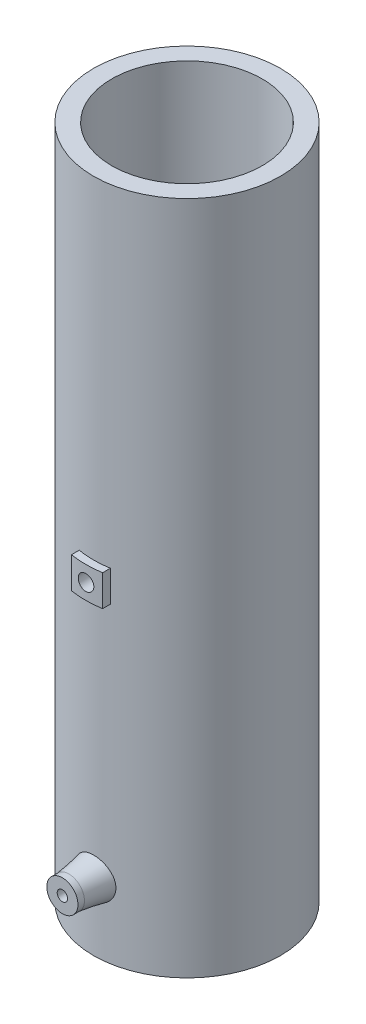
ISO-10303-21;
HEADER;
FILE_DESCRIPTION(('STEP AP214'),'2;1');
FILE_NAME('part.step','',(''),(''),'','','');
FILE_SCHEMA(('AUTOMOTIVE_DESIGN { 1 0 10303 214 1 1 1 1 }'));
ENDSEC;
DATA;
#1=APPLICATION_CONTEXT('core data for automotive mechanical design processes');
#2=APPLICATION_PROTOCOL_DEFINITION('international standard','automotive_design',2000,#1);
#3=PRODUCT_CONTEXT('',#1,'mechanical');
#4=PRODUCT('Part','Part','',(#3));
#5=PRODUCT_RELATED_PRODUCT_CATEGORY('part','',(#4));
#6=PRODUCT_DEFINITION_FORMATION('','',#4);
#7=PRODUCT_DEFINITION_CONTEXT('part definition',#1,'design');
#8=PRODUCT_DEFINITION('design','',#6,#7);
#9=PRODUCT_DEFINITION_SHAPE('','',#8);
#10=(LENGTH_UNIT() NAMED_UNIT(*) SI_UNIT(.MILLI.,.METRE.));
#11=(NAMED_UNIT(*) PLANE_ANGLE_UNIT() SI_UNIT($,.RADIAN.));
#12=(NAMED_UNIT(*) SI_UNIT($,.STERADIAN.) SOLID_ANGLE_UNIT());
#13=UNCERTAINTY_MEASURE_WITH_UNIT(LENGTH_MEASURE(1.E-05),#10,'distance_accuracy_value','');
#14=(GEOMETRIC_REPRESENTATION_CONTEXT(3) GLOBAL_UNCERTAINTY_ASSIGNED_CONTEXT((#13)) GLOBAL_UNIT_ASSIGNED_CONTEXT((#10,
#11,#12)) REPRESENTATION_CONTEXT('',''));
#15=CARTESIAN_POINT('',(0.,0.,0.));
#16=DIRECTION('',(0.,0.,1.));
#17=DIRECTION('',(1.,0.,0.));
#18=AXIS2_PLACEMENT_3D('',#15,#16,#17);
#19=CARTESIAN_POINT('',(0.,130.,0.));
#20=DIRECTION('',(0.,-1.,0.));
#21=DIRECTION('',(0.,0.,-1.));
#22=AXIS2_PLACEMENT_3D('',#19,#20,#21);
#23=CYLINDRICAL_SURFACE('',#22,14.5);
#24=CARTESIAN_POINT('',(0.,3.,0.));
#25=DIRECTION('',(0.,1.,0.));
#26=DIRECTION('',(0.,0.,1.));
#27=AXIS2_PLACEMENT_3D('',#24,#25,#26);
#28=CIRCLE('',#27,14.5);
#29=CARTESIAN_POINT('',(0.,3.,14.5));
#30=VERTEX_POINT('',#29);
#31=EDGE_CURVE('E175',#30,#30,#28,.F.);
#32=ORIENTED_EDGE('',*,*,#31,.T.);
#33=EDGE_LOOP('',(#32));
#34=FACE_BOUND('',#33,.T.);
#35=CARTESIAN_POINT('',(0.,70.,0.));
#36=DIRECTION('',(0.,1.,0.));
#37=DIRECTION('',(0.,0.,1.));
#38=AXIS2_PLACEMENT_3D('',#35,#36,#37);
#39=CIRCLE('',#38,14.5);
#40=CARTESIAN_POINT('',(0.,70.,14.5));
#41=VERTEX_POINT('',#40);
#42=EDGE_CURVE('E348',#41,#41,#39,.T.);
#43=ORIENTED_EDGE('',*,*,#42,.T.);
#44=EDGE_LOOP('',(#43));
#45=FACE_BOUND('',#44,.T.);
#46=ADVANCED_FACE('F39',(#34,#45),#23,.F.);
#47=CARTESIAN_POINT('',(0.,17.1546440631836,16.5006787409066));
#48=CARTESIAN_POINT('',(0.,16.6168185577365,18.5485553936583));
#49=CARTESIAN_POINT('',(0.,16.2319372033277,20.6298593188922));
#50=CARTESIAN_POINT('',(0.,16.,22.744590516445));
#51=B_SPLINE_CURVE_WITH_KNOTS('',3,(#47,#48,#49,#50),.UNSPECIFIED.,.F.,.F.,(4,4),
(0.476118579670464,1.),.UNSPECIFIED.);
#52=CARTESIAN_POINT('',(0.,13.,22.744590516445));
#53=DIRECTION('',(0.,0.,1.));
#54=AXIS1_PLACEMENT('',#52,#53);
#55=SURFACE_OF_REVOLUTION('',#51,#54);
#56=CARTESIAN_POINT('',(0.,13.,22.744590516445));
#57=DIRECTION('',(0.,0.,1.));
#58=DIRECTION('',(0.,-1.,0.));
#59=AXIS2_PLACEMENT_3D('',#56,#57,#58);
#60=CIRCLE('',#59,2.99999999999999);
#61=CARTESIAN_POINT('',(0.,10.,22.744590516445));
#62=VERTEX_POINT('',#61);
#63=EDGE_CURVE('E292',#62,#62,#60,.T.);
#64=ORIENTED_EDGE('',*,*,#63,.F.);
#65=EDGE_LOOP('',(#64));
#66=FACE_BOUND('',#65,.T.);
#67=CARTESIAN_POINT('',(0.,16.7895511266561,18.));
#68=CARTESIAN_POINT('',(0.219367881146538,16.7895408830431,17.9999949470926));
#69=CARTESIAN_POINT('',(0.43884115748846,16.7713456358823,17.9959489427125));
#70=CARTESIAN_POINT('',(0.871608294538341,16.6990493726856,17.980192073096));
#71=CARTESIAN_POINT('',(1.08489754250964,16.6449222390126,17.9684756325722));
#72=CARTESIAN_POINT('',(1.49904871197461,16.5023359598633,17.9386715913121));
#73=CARTESIAN_POINT('',(1.69991859338372,16.4138990745445,17.9205881222041));
#74=CARTESIAN_POINT('',(2.083790673489,16.205072728749,17.8800200315611));
#75=CARTESIAN_POINT('',(2.26679365086065,16.0846846616198,17.8575356019573));
#76=CARTESIAN_POINT('',(2.61082044724427,15.8142711683976,17.8105016600707));
#77=CARTESIAN_POINT('',(2.77171507852356,15.6640831182723,17.7859412608658));
#78=CARTESIAN_POINT('',(3.06554335006947,15.33831783585,17.7376623575127));
#79=CARTESIAN_POINT('',(3.19847752986588,15.162741093568,17.7139438371269));
#80=CARTESIAN_POINT('',(3.43065077163825,14.7930930765488,17.6704405534461));
#81=CARTESIAN_POINT('',(3.53027908230703,14.599272038858,17.6506115540204));
#82=CARTESIAN_POINT('',(3.69445372635883,14.1968157492596,17.6169831442719));
#83=CARTESIAN_POINT('',(3.75901119505109,13.9881852233145,17.6031818203808));
#84=CARTESIAN_POINT('',(3.84863411895951,13.57118459729,17.583800647434));
#85=CARTESIAN_POINT('',(3.87520647207914,13.3631526814325,17.5779076961006));
#86=CARTESIAN_POINT('',(3.89270611575212,12.9455402165863,17.5740415246952));
#87=CARTESIAN_POINT('',(3.88364048152024,12.7359599832309,17.5760667326296));
#88=CARTESIAN_POINT('',(3.83104397567141,12.3277725218479,17.5876026814584));
#89=CARTESIAN_POINT('',(3.7885464601688,12.1290243381599,17.5968889371261));
#90=CARTESIAN_POINT('',(3.67190107671748,11.7414629839712,17.6215965860282));
#91=CARTESIAN_POINT('',(3.59775075393921,11.5526505853152,17.637018455103));
#92=CARTESIAN_POINT('',(3.41882700341177,11.1868795153089,17.6725785026042));
#93=CARTESIAN_POINT('',(3.31358356102876,11.0101582237592,17.6927880485994));
#94=CARTESIAN_POINT('',(3.07615486009854,10.6761825696094,17.7356079480437));
#95=CARTESIAN_POINT('',(2.9439639782208,10.5189322812014,17.7582188021198));
#96=CARTESIAN_POINT('',(2.65015600792629,10.2213012333789,17.804484347769));
#97=CARTESIAN_POINT('',(2.48753043027356,10.081915898707,17.8281427225414));
#98=CARTESIAN_POINT('',(2.14140765593326,9.83154832332276,17.8730187737719));
#99=CARTESIAN_POINT('',(1.95790750754505,9.72057010665523,17.8942361042067));
#100=CARTESIAN_POINT('',(1.56994426527919,9.52730304991342,17.9324897258804));
#101=CARTESIAN_POINT('',(1.36506199079573,9.44582971059513,17.9494038019431));
#102=CARTESIAN_POINT('',(0.944212318915756,9.31792872713374,17.9764539075735));
#103=CARTESIAN_POINT('',(0.728245291977352,9.27149991259807,17.9865901635009));
#104=CARTESIAN_POINT('',(0.291958912750649,9.21509765625611,17.9989511524228));
#105=CARTESIAN_POINT('',(0.0716526598479801,9.20502761047881,18.0011968499263));
#106=CARTESIAN_POINT('',(-0.36752970624008,9.22137441141189,17.997587251392));
#107=CARTESIAN_POINT('',(-0.586405852061066,9.24779042255391,17.9917321408711));
#108=CARTESIAN_POINT('',(-1.01524506197335,9.33607736392399,17.9726212590778));
#109=CARTESIAN_POINT('',(-1.22525143858822,9.39774745980033,17.9594074196963));
#110=CARTESIAN_POINT('',(-1.63183851015086,9.55468591794793,17.9270390055224));
#111=CARTESIAN_POINT('',(-1.82841811426425,9.64995700620597,17.9078839487452));
#112=CARTESIAN_POINT('',(-2.20407421189417,9.87235695832778,17.8655560342375));
#113=CARTESIAN_POINT('',(-2.3830141461493,9.99971077822343,17.8423551776482));
#114=CARTESIAN_POINT('',(-2.7168185915231,10.2828146697912,17.7945878176691));
#115=CARTESIAN_POINT('',(-2.87168166418588,10.4385664368726,17.7700212328036));
#116=CARTESIAN_POINT('',(-3.08221209445954,10.6901892452944,17.7342906097524));
#117=CARTESIAN_POINT('',(-3.14877249929177,10.7770815838087,17.7225647466022));
#118=CARTESIAN_POINT('',(-3.27417131899658,10.9563429257967,17.6998263741978));
#119=CARTESIAN_POINT('',(-3.33301289256224,11.0487096664337,17.6888135740848));
#120=CARTESIAN_POINT('',(-3.44248843959683,11.2383229391268,17.6678347639638));
#121=CARTESIAN_POINT('',(-3.49312044480624,11.3355706341038,17.6578690051869));
#122=CARTESIAN_POINT('',(-3.58568873027812,11.5341998308394,17.6393045454574));
#123=CARTESIAN_POINT('',(-3.62762883542297,11.635579490718,17.6307052435839));
#124=CARTESIAN_POINT('',(-3.70125029730794,11.8384880222387,17.6153942860028));
#125=CARTESIAN_POINT('',(-3.73321454133917,11.9399104353702,17.6086314632663));
#126=CARTESIAN_POINT('',(-3.78832202570741,12.1451799071405,17.5968579903954));
#127=CARTESIAN_POINT('',(-3.81146907701185,12.2490258976164,17.5918465833416));
#128=CARTESIAN_POINT('',(-3.84873484224501,12.4584165367789,17.5837312500881));
#129=CARTESIAN_POINT('',(-3.86285216917581,12.5639614438739,17.5806276169322));
#130=CARTESIAN_POINT('',(-3.88190478915762,12.7758744688236,17.5764305600386));
#131=CARTESIAN_POINT('',(-3.88684389884305,12.882242226022,17.5753363007329));
#132=CARTESIAN_POINT('',(-3.88748797004439,13.0907449238768,17.5751937679563));
#133=CARTESIAN_POINT('',(-3.883554619555,13.1928788800234,17.576065356093));
#134=CARTESIAN_POINT('',(-3.86723178622635,13.3963959130031,17.5796640502755));
#135=CARTESIAN_POINT('',(-3.85484562229033,13.4977792687636,17.5823904280575));
#136=CARTESIAN_POINT('',(-3.82173157124892,13.6991428110409,17.589617797108));
#137=CARTESIAN_POINT('',(-3.80100093994608,13.7991225247451,17.5941193721657));
#138=CARTESIAN_POINT('',(-3.75139659619193,13.9969135827486,17.6047625910228));
#139=CARTESIAN_POINT('',(-3.72252564896542,14.0947256512373,17.6109036778506));
#140=CARTESIAN_POINT('',(-3.65697268881384,14.2873199723802,17.6246324227437));
#141=CARTESIAN_POINT('',(-3.62031005120393,14.3821090817757,17.6322164877955));
#142=CARTESIAN_POINT('',(-3.53944844242793,14.5682764771757,17.6486261653114));
#143=CARTESIAN_POINT('',(-3.49525106379835,14.6596554789732,17.6574515153496));
#144=CARTESIAN_POINT('',(-3.39966900849759,14.8384466587893,17.6761030354994));
#145=CARTESIAN_POINT('',(-3.34828582844385,14.9258596578161,17.6859289970937));
#146=CARTESIAN_POINT('',(-3.23868390560265,15.0962748174684,17.7063276380595));
#147=CARTESIAN_POINT('',(-3.18045928423643,15.1792730944314,17.7169009564509));
#148=CARTESIAN_POINT('',(-2.9916760689963,15.4267126660385,17.7501147549728));
#149=CARTESIAN_POINT('',(-2.85047245204081,15.5831059670765,17.7735433326697));
#150=CARTESIAN_POINT('',(-2.5444366564685,15.8708526598255,17.8199245466254));
#151=CARTESIAN_POINT('',(-2.37959947157502,16.0022007324592,17.8428770808623));
#152=CARTESIAN_POINT('',(-2.11482902522533,16.1802700301749,17.8755658153025));
#153=CARTESIAN_POINT('',(-2.02181024887938,16.2373095617564,17.8863490938));
#154=CARTESIAN_POINT('',(-1.83131784226045,16.3434419817829,17.9068542267825));
#155=CARTESIAN_POINT('',(-1.73384832439641,16.3925420229954,17.9165770340571));
#156=CARTESIAN_POINT('',(-1.53509270877604,16.4825022653552,17.9346994358731));
#157=CARTESIAN_POINT('',(-1.43380763393326,16.5233646565387,17.9430993819761));
#158=CARTESIAN_POINT('',(-1.22810729476995,16.59659547583,17.9583519663276));
#159=CARTESIAN_POINT('',(-1.12369181159655,16.6289633085168,17.9652044961062));
#160=CARTESIAN_POINT('',(-0.852383685761242,16.7008884144118,17.9805695546685));
#161=CARTESIAN_POINT('',(-0.683682883519985,16.7340909048799,17.9878150532298));
#162=CARTESIAN_POINT('',(-0.343342880197669,16.7784260964791,17.9975322158809));
#163=CARTESIAN_POINT('',(-0.17170372535023,16.7895591445414,18.000003955014));
#164=CARTESIAN_POINT('',(0.,16.7895511266561,18.));
#165=B_SPLINE_CURVE_WITH_KNOTS('',3,(#67,#68,#69,#70,#71,#72,#73,#74,#75,#76,#77,#78,#79,#80,
#81,#82,#83,#84,#85,#86,#87,#88,#89,#90,#91,#92,#93,#94,#95,#96,#97,#98,#99,#100,#101,#102,#103,
#104,#105,#106,#107,#108,#109,#110,#111,#112,#113,#114,#115,#116,#117,#118,#119,#120,#121,#122,
#123,#124,#125,#126,#127,#128,#129,#130,#131,#132,#133,#134,#135,#136,#137,#138,#139,#140,#141,
#142,#143,#144,#145,#146,#147,#148,#149,#150,#151,#152,#153,#154,#155,#156,#157,#158,#159,#160,
#161,#162,#163,#164),.UNSPECIFIED.,.T.,.F.,(4,2,2,2,2,2,2,2,2,2,2,2,2,2,2,2,2,2,2,2,2,2,2,2,2,2,
2,2,2,2,2,2,2,2,2,2,2,2,2,2,2,2,2,2,2,2,2,2,4),(0.,0.657503953699296,1.31548634817988,
1.97304255586536,2.63057009312932,3.29178978428887,3.95299671526615,4.60618133045488,
5.25915843223233,5.8854351275887,6.51158749442228,7.11911197771862,7.72668358606392,
8.34395542537588,8.96135620767712,9.6048828087745,10.2485005190281,10.9087505539931,
11.5689785374126,12.2274510220385,12.8859084272149,13.5406516109613,14.1954479250423,
14.8549699184803,15.5145312994867,15.8444418927631,16.174217056351,16.504071167621,
16.8337798164826,17.1530440686801,17.4721701714679,17.7913452814008,18.1103876370624,
18.4166601899301,18.7228125574196,19.0290656898616,19.3352149147174,19.6406115753429,
19.9459437674332,20.2512124611362,20.5567454051577,21.1897292840242,21.8228474459232,
22.1514602661166,22.4797753660723,22.808003065743,23.1362537662016,23.650903643181,
24.1655454298119),.UNSPECIFIED.);
#166=CARTESIAN_POINT('',(0.,16.7895511266561,18.));
#167=VERTEX_POINT('',#166);
#168=EDGE_CURVE('E279',#167,#167,#165,.T.);
#169=ORIENTED_EDGE('',*,*,#168,.F.);
#170=EDGE_LOOP('',(#169));
#171=FACE_BOUND('',#170,.T.);
#172=ADVANCED_FACE('F239',(#66,#171),#55,.T.);
#173=CARTESIAN_POINT('',(0.,13.,17.));
#174=DIRECTION('',(0.,0.,1.));
#175=DIRECTION('',(1.,0.,0.));
#176=AXIS2_PLACEMENT_3D('',#173,#174,#175);
#177=CYLINDRICAL_SURFACE('',#176,3.);
#178=CARTESIAN_POINT('',(0.,13.,24.));
#179=DIRECTION('',(0.,0.,1.));
#180=DIRECTION('',(1.,0.,0.));
#181=AXIS2_PLACEMENT_3D('',#178,#179,#180);
#182=CIRCLE('',#181,3.);
#183=CARTESIAN_POINT('',(3.,13.,24.));
#184=VERTEX_POINT('',#183);
#185=EDGE_CURVE('E285',#184,#184,#182,.T.);
#186=ORIENTED_EDGE('',*,*,#185,.F.);
#187=EDGE_LOOP('',(#186));
#188=FACE_BOUND('',#187,.T.);
#189=ORIENTED_EDGE('',*,*,#63,.T.);
#190=EDGE_LOOP('',(#189));
#191=FACE_BOUND('',#190,.T.);
#192=ADVANCED_FACE('F247',(#188,#191),#177,.T.);
#193=CARTESIAN_POINT('',(0.,13.,24.));
#194=DIRECTION('',(0.,0.,1.));
#195=DIRECTION('',(1.,0.,0.));
#196=AXIS2_PLACEMENT_3D('',#193,#194,#195);
#197=PLANE('',#196);
#198=CARTESIAN_POINT('',(0.,13.,24.));
#199=DIRECTION('',(0.,0.,1.));
#200=DIRECTION('',(1.,0.,0.));
#201=AXIS2_PLACEMENT_3D('',#198,#199,#200);
#202=CIRCLE('',#201,1.);
#203=CARTESIAN_POINT('',(1.,13.,24.));
#204=VERTEX_POINT('',#203);
#205=EDGE_CURVE('E353',#204,#204,#202,.T.);
#206=ORIENTED_EDGE('',*,*,#205,.F.);
#207=EDGE_LOOP('',(#206));
#208=FACE_BOUND('',#207,.T.);
#209=ORIENTED_EDGE('',*,*,#185,.T.);
#210=EDGE_LOOP('',(#209));
#211=FACE_BOUND('',#210,.T.);
#212=ADVANCED_FACE('F276',(#208,#211),#197,.T.);
#213=CARTESIAN_POINT('',(0.,130.,0.));
#214=DIRECTION('',(0.,-1.,0.));
#215=DIRECTION('',(0.,0.,-1.));
#216=AXIS2_PLACEMENT_3D('',#213,#214,#215);
#217=CYLINDRICAL_SURFACE('',#216,18.);
#218=CARTESIAN_POINT('',(0.,66.,0.));
#219=DIRECTION('',(0.,-1.,0.));
#220=DIRECTION('',(0.,0.,-1.));
#221=AXIS2_PLACEMENT_3D('',#218,#219,#220);
#222=CIRCLE('',#221,18.);
#223=CARTESIAN_POINT('',(-3.00000000000001,66.,-17.7482393492988));
#224=VERTEX_POINT('',#223);
#225=CARTESIAN_POINT('',(2.99999999999999,66.,-17.7482393492988));
#226=VERTEX_POINT('',#225);
#227=EDGE_CURVE('E115',#224,#226,#222,.T.);
#228=ORIENTED_EDGE('',*,*,#227,.F.);
#229=DIRECTION('',(0.,-1.,0.));
#230=VECTOR('',#229,1.);
#231=CARTESIAN_POINT('',(-3.00000000000001,66.,-17.7482393492988));
#232=LINE('',#231,#230);
#233=CARTESIAN_POINT('',(-3.00000000000001,60.,-17.7482393492988));
#234=VERTEX_POINT('',#233);
#235=EDGE_CURVE('E112',#224,#234,#232,.T.);
#236=ORIENTED_EDGE('',*,*,#235,.T.);
#237=CARTESIAN_POINT('',(0.,60.,0.));
#238=DIRECTION('',(0.,-1.,0.));
#239=DIRECTION('',(0.,0.,-1.));
#240=AXIS2_PLACEMENT_3D('',#237,#238,#239);
#241=CIRCLE('',#240,18.);
#242=CARTESIAN_POINT('',(2.99999999999999,60.,-17.7482393492989));
#243=VERTEX_POINT('',#242);
#244=EDGE_CURVE('E370',#234,#243,#241,.T.);
#245=ORIENTED_EDGE('',*,*,#244,.T.);
#246=DIRECTION('',(0.,-1.,0.));
#247=VECTOR('',#246,1.);
#248=CARTESIAN_POINT('',(2.99999999999999,66.,-17.7482393492988));
#249=LINE('',#248,#247);
#250=EDGE_CURVE('E134',#226,#243,#249,.T.);
#251=ORIENTED_EDGE('',*,*,#250,.F.);
#252=EDGE_LOOP('',(#228,#236,#245,#251));
#253=FACE_BOUND('',#252,.T.);
#254=DIRECTION('',(0.,-1.,0.));
#255=VECTOR('',#254,1.);
#256=CARTESIAN_POINT('',(-3.00000000000001,66.,17.7482393492988));
#257=LINE('',#256,#255);
#258=CARTESIAN_POINT('',(-3.,66.,17.7482393492988));
#259=VERTEX_POINT('',#258);
#260=CARTESIAN_POINT('',(-3.,60.,17.7482393492988));
#261=VERTEX_POINT('',#260);
#262=EDGE_CURVE('E155',#259,#261,#257,.T.);
#263=ORIENTED_EDGE('',*,*,#262,.F.);
#264=CARTESIAN_POINT('',(0.,66.,0.));
#265=DIRECTION('',(0.,-1.,0.));
#266=DIRECTION('',(0.,0.,1.));
#267=AXIS2_PLACEMENT_3D('',#264,#265,#266);
#268=CIRCLE('',#267,18.);
#269=CARTESIAN_POINT('',(3.,66.,17.7482393492989));
#270=VERTEX_POINT('',#269);
#271=EDGE_CURVE('E62',#270,#259,#268,.T.);
#272=ORIENTED_EDGE('',*,*,#271,.F.);
#273=DIRECTION('',(0.,-1.,0.));
#274=VECTOR('',#273,1.);
#275=CARTESIAN_POINT('',(3.,66.,17.7482393492988));
#276=LINE('',#275,#274);
#277=CARTESIAN_POINT('',(3.,60.,17.7482393492988));
#278=VERTEX_POINT('',#277);
#279=EDGE_CURVE('E158',#270,#278,#276,.T.);
#280=ORIENTED_EDGE('',*,*,#279,.T.);
#281=CARTESIAN_POINT('',(0.,60.,0.));
#282=DIRECTION('',(0.,-1.,0.));
#283=DIRECTION('',(0.,0.,1.));
#284=AXIS2_PLACEMENT_3D('',#281,#282,#283);
#285=CIRCLE('',#284,18.);
#286=EDGE_CURVE('E150',#278,#261,#285,.T.);
#287=ORIENTED_EDGE('',*,*,#286,.T.);
#288=EDGE_LOOP('',(#263,#272,#280,#287));
#289=FACE_BOUND('',#288,.T.);
#290=CARTESIAN_POINT('',(0.,130.,0.));
#291=DIRECTION('',(0.,1.,0.));
#292=DIRECTION('',(0.,0.,1.));
#293=AXIS2_PLACEMENT_3D('',#290,#291,#292);
#294=CIRCLE('',#293,18.);
#295=CARTESIAN_POINT('',(0.,130.,18.));
#296=VERTEX_POINT('',#295);
#297=EDGE_CURVE('E167',#296,#296,#294,.T.);
#298=ORIENTED_EDGE('',*,*,#297,.F.);
#299=EDGE_LOOP('',(#298));
#300=FACE_BOUND('',#299,.T.);
#301=CARTESIAN_POINT('',(0.,0.,0.));
#302=DIRECTION('',(0.,1.,0.));
#303=DIRECTION('',(0.,0.,1.));
#304=AXIS2_PLACEMENT_3D('',#301,#302,#303);
#305=CIRCLE('',#304,18.);
#306=CARTESIAN_POINT('',(0.,0.,18.));
#307=VERTEX_POINT('',#306);
#308=EDGE_CURVE('E166',#307,#307,#305,.T.);
#309=ORIENTED_EDGE('',*,*,#308,.T.);
#310=EDGE_LOOP('',(#309));
#311=FACE_BOUND('',#310,.T.);
#312=ORIENTED_EDGE('',*,*,#168,.T.);
#313=EDGE_LOOP('',(#312));
#314=FACE_BOUND('',#313,.T.);
#315=ADVANCED_FACE('F219',(#253,#289,#300,#311,#314),#217,.T.);
#316=CARTESIAN_POINT('',(0.,66.,0.));
#317=DIRECTION('',(0.,-1.,0.));
#318=DIRECTION('',(0.,0.,-1.));
#319=AXIS2_PLACEMENT_3D('',#316,#317,#318);
#320=CYLINDRICAL_SURFACE('',#319,19.5);
#321=CARTESIAN_POINT('',(0.,60.,0.));
#322=DIRECTION('',(0.,1.,0.));
#323=DIRECTION('',(0.,0.,-1.));
#324=AXIS2_PLACEMENT_3D('',#321,#322,#323);
#325=CIRCLE('',#324,19.5);
#326=CARTESIAN_POINT('',(2.99999999999999,60.,-19.2678488679977));
#327=VERTEX_POINT('',#326);
#328=CARTESIAN_POINT('',(-3.00000000000001,60.,-19.2678488679977));
#329=VERTEX_POINT('',#328);
#330=EDGE_CURVE('E128',#327,#329,#325,.T.);
#331=ORIENTED_EDGE('',*,*,#330,.T.);
#332=DIRECTION('',(0.,-1.,0.));
#333=VECTOR('',#332,1.);
#334=CARTESIAN_POINT('',(-3.00000000000001,66.,-19.2678488679977));
#335=LINE('',#334,#333);
#336=CARTESIAN_POINT('',(-3.00000000000001,66.,-19.2678488679977));
#337=VERTEX_POINT('',#336);
#338=EDGE_CURVE('E109',#337,#329,#335,.T.);
#339=ORIENTED_EDGE('',*,*,#338,.F.);
#340=CARTESIAN_POINT('',(0.,66.,0.));
#341=DIRECTION('',(0.,1.,0.));
#342=DIRECTION('',(0.,0.,-1.));
#343=AXIS2_PLACEMENT_3D('',#340,#341,#342);
#344=CIRCLE('',#343,19.5);
#345=CARTESIAN_POINT('',(2.99999999999999,66.,-19.2678488679977));
#346=VERTEX_POINT('',#345);
#347=EDGE_CURVE('E116',#346,#337,#344,.T.);
#348=ORIENTED_EDGE('',*,*,#347,.F.);
#349=DIRECTION('',(0.,-1.,0.));
#350=VECTOR('',#349,1.);
#351=CARTESIAN_POINT('',(2.99999999999999,66.,-19.2678488679977));
#352=LINE('',#351,#350);
#353=EDGE_CURVE('E366',#346,#327,#352,.T.);
#354=ORIENTED_EDGE('',*,*,#353,.T.);
#355=EDGE_LOOP('',(#331,#339,#348,#354));
#356=FACE_BOUND('',#355,.T.);
#357=CARTESIAN_POINT('',(-1.5,63.,-19.4422220952236));
#358=CARTESIAN_POINT('',(-1.49999631574899,63.0841218209653,-19.4422228633041));
#359=CARTESIAN_POINT('',(-1.49289972127123,63.1683014634754,-19.4427739330482));
#360=CARTESIAN_POINT('',(-1.46469362667531,63.3343332095599,-19.4449187426416));
#361=CARTESIAN_POINT('',(-1.44356810247271,63.4161825397913,-19.4465136747781));
#362=CARTESIAN_POINT('',(-1.38791731988865,63.5751248335152,-19.4505644970823));
#363=CARTESIAN_POINT('',(-1.35339948110189,63.6522204033193,-19.4530199104544));
#364=CARTESIAN_POINT('',(-1.27195671377478,63.7995043811311,-19.4585144316203));
#365=CARTESIAN_POINT('',(-1.22503450132071,63.8696942966036,-19.4615534115954));
#366=CARTESIAN_POINT('',(-1.12000263338117,64.0013484239914,-19.4678801935239));
#367=CARTESIAN_POINT('',(-1.06187128842766,64.0627953110522,-19.4711684702524));
#368=CARTESIAN_POINT('',(-0.936116911600153,64.1750704473382,-19.4776189711848));
#369=CARTESIAN_POINT('',(-0.868493471674471,64.2258982398299,-19.4807811899622));
#370=CARTESIAN_POINT('',(-0.725572613192578,64.3155488533082,-19.4866276705918));
#371=CARTESIAN_POINT('',(-0.650265874476244,64.3543568579828,-19.489311340842));
#372=CARTESIAN_POINT('',(-0.494181222990736,64.4187714912119,-19.4938932586097));
#373=CARTESIAN_POINT('',(-0.413403393407067,64.4443783204333,-19.4957915180659));
#374=CARTESIAN_POINT('',(-0.248840568470021,64.4816143253898,-19.4985854224138));
#375=CARTESIAN_POINT('',(-0.165061897902814,64.4932713012665,-19.4994830611597));
#376=CARTESIAN_POINT('',(0.00326740207570478,64.5023626118021,-19.5001813289501));
#377=CARTESIAN_POINT('',(0.0878180190185275,64.4997971757774,-19.499981975682));
#378=CARTESIAN_POINT('',(0.25510269932209,64.4805392837281,-19.4985103721302));
#379=CARTESIAN_POINT('',(0.337840227191438,64.4638767247238,-19.4972403924393));
#380=CARTESIAN_POINT('',(0.499340617508276,64.4169440321562,-19.4937730367368));
#381=CARTESIAN_POINT('',(0.578103446908418,64.3866737854735,-19.4915756530158));
#382=CARTESIAN_POINT('',(0.729514077768111,64.3133514768571,-19.4864968548647));
#383=CARTESIAN_POINT('',(0.802155344031296,64.2702859715407,-19.4836147216416));
#384=CARTESIAN_POINT('',(0.93918949076232,64.1726053822339,-19.4774904753352));
#385=CARTESIAN_POINT('',(1.00358222904307,64.1179900991928,-19.4742483560483));
#386=CARTESIAN_POINT('',(1.12246614710652,63.998591661324,-19.4677587618373));
#387=CARTESIAN_POINT('',(1.17693124962327,63.9337825378062,-19.4645112947908));
#388=CARTESIAN_POINT('',(1.27421250391811,63.7959267728802,-19.4583854923998));
#389=CARTESIAN_POINT('',(1.31702864802573,63.722880126048,-19.4555071572984));
#390=CARTESIAN_POINT('',(1.38979530838062,63.570605115097,-19.4504448818225));
#391=CARTESIAN_POINT('',(1.41974455757571,63.4913761430885,-19.4482610098399));
#392=CARTESIAN_POINT('',(1.46590841431393,63.3289938501676,-19.4448361532386));
#393=CARTESIAN_POINT('',(1.4821232674083,63.2458405994437,-19.4435951517629));
#394=CARTESIAN_POINT('',(1.50032521711051,63.0781981073134,-19.4421991827871));
#395=CARTESIAN_POINT('',(1.50234863950283,62.9937128321163,-19.4420414424866));
#396=CARTESIAN_POINT('',(1.49220536280752,62.8256042211274,-19.442822532323));
#397=CARTESIAN_POINT('',(1.48003877623035,62.7419808785069,-19.4437613537655));
#398=CARTESIAN_POINT('',(1.44189109319665,62.5780736470628,-19.4466272512431));
#399=CARTESIAN_POINT('',(1.41592687389977,62.4977858073593,-19.4485531198277));
#400=CARTESIAN_POINT('',(1.35093808931543,62.3427064197737,-19.453175097364));
#401=CARTESIAN_POINT('',(1.31191334504912,62.2679149472299,-19.4558712168711));
#402=CARTESIAN_POINT('',(1.22181905245209,62.1257849043228,-19.4617366247596));
#403=CARTESIAN_POINT('',(1.17072525216927,62.0584617466434,-19.4649068610785));
#404=CARTESIAN_POINT('',(1.0579783295726,61.9333349905526,-19.4713600420266));
#405=CARTESIAN_POINT('',(0.996325052148734,61.8755315320023,-19.4746429883108));
#406=CARTESIAN_POINT('',(0.864052522200132,61.7709614440765,-19.4809598855366));
#407=CARTESIAN_POINT('',(0.79341460694102,61.7242183843951,-19.483993295908));
#408=CARTESIAN_POINT('',(0.64527122566449,61.643257527384,-19.4894615557931));
#409=CARTESIAN_POINT('',(0.567765819502642,61.6090396209011,-19.4918964105229));
#410=CARTESIAN_POINT('',(0.408172746557421,61.5541410468313,-19.4958907020376));
#411=CARTESIAN_POINT('',(0.326090157813739,61.533445688985,-19.4974510885402));
#412=CARTESIAN_POINT('',(0.15960277868343,61.5061316433128,-19.4995244656211));
#413=CARTESIAN_POINT('',(0.0751980251279676,61.4995127323549,-19.5000374728017));
#414=CARTESIAN_POINT('',(-0.0933051071269376,61.5005419047859,-19.4999583243571));
#415=CARTESIAN_POINT('',(-0.177403714279082,61.5081532054809,-19.4993690180242));
#416=CARTESIAN_POINT('',(-0.343124664279774,61.5373501864461,-19.4971571119714));
#417=CARTESIAN_POINT('',(-0.424747003382091,61.5589358878564,-19.4955345106884));
#418=CARTESIAN_POINT('',(-0.583201826960044,61.6154599014645,-19.491438174492));
#419=CARTESIAN_POINT('',(-0.660034492616571,61.6503977082299,-19.4889644717968));
#420=CARTESIAN_POINT('',(-0.806749327216248,61.7326297611776,-19.4834430138735));
#421=CARTESIAN_POINT('',(-0.876631629665976,61.7799237699515,-19.4803952696752));
#422=CARTESIAN_POINT('',(-1.00764995731289,61.8856634677085,-19.4740586857643));
#423=CARTESIAN_POINT('',(-1.06876409258816,61.9441362449744,-19.4707692726148));
#424=CARTESIAN_POINT('',(-1.18033348175136,62.0705274860265,-19.4643249240889));
#425=CARTESIAN_POINT('',(-1.23078614185975,62.138448241717,-19.4611700215855));
#426=CARTESIAN_POINT('',(-1.31965805682755,62.2819206562571,-19.4553461947554));
#427=CARTESIAN_POINT('',(-1.35805724417475,62.3574847667349,-19.452678083935));
#428=CARTESIAN_POINT('',(-1.42157461363322,62.5139556369755,-19.4481399893572));
#429=CARTESIAN_POINT('',(-1.44670816172254,62.5948560926999,-19.4462690826613));
#430=CARTESIAN_POINT('',(-1.47653505116189,62.7301999618517,-19.4440214996775));
#431=CARTESIAN_POINT('',(-1.48532281838425,62.7837713446634,-19.4433497954675));
#432=CARTESIAN_POINT('',(-1.49705647395518,62.8915538077967,-19.4424498461356));
#433=CARTESIAN_POINT('',(-1.50000237531438,62.9457648866934,-19.4422216000259));
#434=CARTESIAN_POINT('',(-1.5,63.,-19.4422220952236));
#435=B_SPLINE_CURVE_WITH_KNOTS('',3,(#357,#358,#359,#360,#361,#362,#363,#364,#365,#366,#367,
#368,#369,#370,#371,#372,#373,#374,#375,#376,#377,#378,#379,#380,#381,#382,#383,#384,#385,#386,
#387,#388,#389,#390,#391,#392,#393,#394,#395,#396,#397,#398,#399,#400,#401,#402,#403,#404,#405,
#406,#407,#408,#409,#410,#411,#412,#413,#414,#415,#416,#417,#418,#419,#420,#421,#422,#423,#424,
#425,#426,#427,#428,#429,#430,#431,#432,#433,#434),.UNSPECIFIED.,.T.,.F.,(4,2,2,2,2,2,2,2,2,2,2,
2,2,2,2,2,2,2,2,2,2,2,2,2,2,2,2,2,2,2,2,2,2,2,2,2,2,2,4),(0.,0.252167450955832,
0.504623428461216,0.756939739858951,1.00920084927065,1.2619550685109,1.51472015662593,
1.76779558941352,2.02086717516506,2.2734335796299,2.52599591182977,2.77802395148306,
3.03005408626052,3.28234995942906,3.5346501810572,3.7876038670757,4.04055771965585,
4.29353647585958,4.54651070907147,4.79883716739947,5.05116162508227,5.30317814943868,
5.55519812752136,5.80772889659336,6.06026337545243,6.31333125360592,6.56639692629128,
6.81918722125369,7.07197350909319,7.32410729027307,7.57624145287526,7.82836607210299,
8.08048584744017,8.33322448331826,8.58602453616592,8.8392432639228,9.09216803372078,
9.25474607324797,9.4173237506909),.UNSPECIFIED.);
#436=CARTESIAN_POINT('',(-1.5,63.,-19.4422220952236));
#437=VERTEX_POINT('',#436);
#438=EDGE_CURVE('E186',#437,#437,#435,.T.);
#439=ORIENTED_EDGE('',*,*,#438,.F.);
#440=EDGE_LOOP('',(#439));
#441=FACE_BOUND('',#440,.T.);
#442=ADVANCED_FACE('F126',(#356,#441),#320,.T.);
#443=CARTESIAN_POINT('',(0.,130.,0.));
#444=DIRECTION('',(0.,1.,0.));
#445=DIRECTION('',(0.,0.,1.));
#446=AXIS2_PLACEMENT_3D('',#443,#444,#445);
#447=PLANE('',#446);
#448=ORIENTED_EDGE('',*,*,#297,.T.);
#449=EDGE_LOOP('',(#448));
#450=FACE_BOUND('',#449,.T.);
#451=CARTESIAN_POINT('',(0.,130.,0.));
#452=DIRECTION('',(0.,1.,0.));
#453=DIRECTION('',(0.,0.,1.));
#454=AXIS2_PLACEMENT_3D('',#451,#452,#453);
#455=CIRCLE('',#454,14.5);
#456=CARTESIAN_POINT('',(0.,130.,14.5));
#457=VERTEX_POINT('',#456);
#458=EDGE_CURVE('E163',#457,#457,#455,.T.);
#459=ORIENTED_EDGE('',*,*,#458,.F.);
#460=EDGE_LOOP('',(#459));
#461=FACE_BOUND('',#460,.T.);
#462=ADVANCED_FACE('F218',(#450,#461),#447,.T.);
#463=CARTESIAN_POINT('',(0.,0.,0.));
#464=DIRECTION('',(0.,1.,0.));
#465=DIRECTION('',(0.,0.,1.));
#466=AXIS2_PLACEMENT_3D('',#463,#464,#465);
#467=PLANE('',#466);
#468=CARTESIAN_POINT('',(0.,0.,0.));
#469=DIRECTION('',(0.,1.,0.));
#470=DIRECTION('',(0.,0.,1.));
#471=AXIS2_PLACEMENT_3D('',#468,#469,#470);
#472=CIRCLE('',#471,17.5);
#473=CARTESIAN_POINT('',(0.,0.,17.5));
#474=VERTEX_POINT('',#473);
#475=EDGE_CURVE('E170',#474,#474,#472,.T.);
#476=ORIENTED_EDGE('',*,*,#475,.T.);
#477=EDGE_LOOP('',(#476));
#478=FACE_BOUND('',#477,.T.);
#479=ORIENTED_EDGE('',*,*,#308,.F.);
#480=EDGE_LOOP('',(#479));
#481=FACE_BOUND('',#480,.T.);
#482=ADVANCED_FACE('F253',(#478,#481),#467,.F.);
#483=CARTESIAN_POINT('',(0.,82.,0.));
#484=DIRECTION('',(0.,1.,0.));
#485=DIRECTION('',(0.,0.,1.));
#486=AXIS2_PLACEMENT_3D('',#483,#484,#485);
#487=CIRCLE('',#486,14.5);
#488=CARTESIAN_POINT('',(0.,82.,14.5));
#489=VERTEX_POINT('',#488);
#490=EDGE_CURVE('E11',#489,#489,#487,.F.);
#491=ORIENTED_EDGE('',*,*,#490,.T.);
#492=EDGE_LOOP('',(#491));
#493=FACE_BOUND('',#492,.T.);
#494=ORIENTED_EDGE('',*,*,#458,.T.);
#495=EDGE_LOOP('',(#494));
#496=FACE_BOUND('',#495,.T.);
#497=ADVANCED_FACE('F241',(#493,#496),#23,.F.);
#498=CARTESIAN_POINT('',(0.,3.,0.));
#499=DIRECTION('',(0.,1.,0.));
#500=DIRECTION('',(0.,0.,1.));
#501=AXIS2_PLACEMENT_3D('',#498,#499,#500);
#502=TOROIDAL_SURFACE('',#501,17.5,3.);
#503=ORIENTED_EDGE('',*,*,#31,.F.);
#504=EDGE_LOOP('',(#503));
#505=FACE_BOUND('',#504,.T.);
#506=ORIENTED_EDGE('',*,*,#475,.F.);
#507=EDGE_LOOP('',(#506));
#508=FACE_BOUND('',#507,.T.);
#509=ADVANCED_FACE('F236',(#505,#508),#502,.T.);
#510=CARTESIAN_POINT('',(0.,66.,0.));
#511=DIRECTION('',(0.,-1.,0.));
#512=DIRECTION('',(0.,0.,-1.));
#513=AXIS2_PLACEMENT_3D('',#510,#511,#512);
#514=CYLINDRICAL_SURFACE('',#513,19.5);
#515=CARTESIAN_POINT('',(1.5,63.,19.4422220952236));
#516=CARTESIAN_POINT('',(1.49999631574899,62.9158781790347,19.4422228633041));
#517=CARTESIAN_POINT('',(1.49289972127123,62.8316985365246,19.4427739330482));
#518=CARTESIAN_POINT('',(1.46469362667531,62.6656667904402,19.4449187426415));
#519=CARTESIAN_POINT('',(1.44356810247271,62.5838174602087,19.4465136747781));
#520=CARTESIAN_POINT('',(1.38791731988865,62.4248751664848,19.4505644970823));
#521=CARTESIAN_POINT('',(1.35339948110188,62.3477795966807,19.4530199104544));
#522=CARTESIAN_POINT('',(1.27195671377477,62.2004956188689,19.4585144316203));
#523=CARTESIAN_POINT('',(1.22503450132071,62.1303057033964,19.4615534115954));
#524=CARTESIAN_POINT('',(1.12000263338118,61.9986515760086,19.4678801935239));
#525=CARTESIAN_POINT('',(1.06187128842766,61.9372046889478,19.4711684702524));
#526=CARTESIAN_POINT('',(0.936116911600152,61.8249295526618,19.4776189711848));
#527=CARTESIAN_POINT('',(0.868493471674469,61.7741017601701,19.4807811899622));
#528=CARTESIAN_POINT('',(0.725572613192576,61.6844511466918,19.4866276705918));
#529=CARTESIAN_POINT('',(0.650265874476243,61.6456431420172,19.489311340842));
#530=CARTESIAN_POINT('',(0.494181222990739,61.5812285087881,19.4938932586097));
#531=CARTESIAN_POINT('',(0.413403393407074,61.5556216795667,19.4957915180659));
#532=CARTESIAN_POINT('',(0.248840568470029,61.5183856746102,19.4985854224138));
#533=CARTESIAN_POINT('',(0.165061897902821,61.5067286987336,19.4994830611597));
#534=CARTESIAN_POINT('',(-0.00326740207570215,61.4976373881979,19.5001813289501));
#535=CARTESIAN_POINT('',(-0.0878180190185273,61.5002028242226,19.499981975682));
#536=CARTESIAN_POINT('',(-0.25510269932209,61.5194607162719,19.4985103721302));
#537=CARTESIAN_POINT('',(-0.337840227191436,61.5361232752762,19.4972403924393));
#538=CARTESIAN_POINT('',(-0.499340617508274,61.5830559678438,19.4937730367368));
#539=CARTESIAN_POINT('',(-0.578103446908417,61.6133262145265,19.4915756530157));
#540=CARTESIAN_POINT('',(-0.729514077768109,61.6866485231429,19.4864968548647));
#541=CARTESIAN_POINT('',(-0.80215534403129,61.7297140284593,19.4836147216416));
#542=CARTESIAN_POINT('',(-0.939189490762313,61.8273946177661,19.4774904753352));
#543=CARTESIAN_POINT('',(-1.00358222904306,61.8820099008072,19.4742483560483));
#544=CARTESIAN_POINT('',(-1.12246614710652,62.001408338676,19.4677587618373));
#545=CARTESIAN_POINT('',(-1.17693124962327,62.0662174621938,19.4645112947908));
#546=CARTESIAN_POINT('',(-1.27421250391811,62.2040732271198,19.4583854923998));
#547=CARTESIAN_POINT('',(-1.31702864802573,62.277119873952,19.4555071572984));
#548=CARTESIAN_POINT('',(-1.38979530838062,62.429394884903,19.4504448818225));
#549=CARTESIAN_POINT('',(-1.41974455757571,62.5086238569115,19.4482610098399));
#550=CARTESIAN_POINT('',(-1.46590841431393,62.6710061498324,19.4448361532386));
#551=CARTESIAN_POINT('',(-1.4821232674083,62.7541594005562,19.4435951517629));
#552=CARTESIAN_POINT('',(-1.50032521711051,62.9218018926866,19.442199182787));
#553=CARTESIAN_POINT('',(-1.50234863950283,63.0062871678837,19.4420414424866));
#554=CARTESIAN_POINT('',(-1.49220536280752,63.1743957788726,19.442822532323));
#555=CARTESIAN_POINT('',(-1.48003877623035,63.2580191214931,19.4437613537655));
#556=CARTESIAN_POINT('',(-1.44189109319665,63.4219263529372,19.4466272512431));
#557=CARTESIAN_POINT('',(-1.41592687389977,63.5022141926407,19.4485531198277));
#558=CARTESIAN_POINT('',(-1.35093808931543,63.6572935802263,19.453175097364));
#559=CARTESIAN_POINT('',(-1.31191334504912,63.73208505277,19.4558712168711));
#560=CARTESIAN_POINT('',(-1.22181905245209,63.8742150956772,19.4617366247596));
#561=CARTESIAN_POINT('',(-1.17072525216927,63.9415382533566,19.4649068610785));
#562=CARTESIAN_POINT('',(-1.0579783295726,64.0666650094474,19.4713600420266));
#563=CARTESIAN_POINT('',(-0.996325052148734,64.1244684679976,19.4746429883108));
#564=CARTESIAN_POINT('',(-0.86405252220013,64.2290385559235,19.4809598855366));
#565=CARTESIAN_POINT('',(-0.793414606941017,64.2757816156049,19.483993295908));
#566=CARTESIAN_POINT('',(-0.645271225664486,64.356742472616,19.4894615557931));
#567=CARTESIAN_POINT('',(-0.567765819502638,64.3909603790989,19.4918964105229));
#568=CARTESIAN_POINT('',(-0.408172746557418,64.4458589531687,19.4958907020376));
#569=CARTESIAN_POINT('',(-0.326090157813738,64.466554311015,19.4974510885402));
#570=CARTESIAN_POINT('',(-0.15960277868343,64.4938683566872,19.4995244656211));
#571=CARTESIAN_POINT('',(-0.0751980251279692,64.5004872676451,19.5000374728017));
#572=CARTESIAN_POINT('',(0.093305107126936,64.4994580952141,19.4999583243571));
#573=CARTESIAN_POINT('',(0.177403714279082,64.4918467945191,19.4993690180242));
#574=CARTESIAN_POINT('',(0.343124664279773,64.4626498135539,19.4971571119714));
#575=CARTESIAN_POINT('',(0.42474700338209,64.4410641121436,19.4955345106884));
#576=CARTESIAN_POINT('',(0.583201826960042,64.3845400985355,19.491438174492));
#577=CARTESIAN_POINT('',(0.660034492616571,64.3496022917701,19.4889644717968));
#578=CARTESIAN_POINT('',(0.806749327216249,64.2673702388224,19.4834430138735));
#579=CARTESIAN_POINT('',(0.876631629665976,64.2200762300484,19.4803952696752));
#580=CARTESIAN_POINT('',(1.00764995731289,64.1143365322915,19.4740586857643));
#581=CARTESIAN_POINT('',(1.06876409258815,64.0558637550256,19.4707692726148));
#582=CARTESIAN_POINT('',(1.18033348175135,63.9294725139735,19.4643249240889));
#583=CARTESIAN_POINT('',(1.23078614185974,63.861551758283,19.4611700215855));
#584=CARTESIAN_POINT('',(1.31965805682755,63.7180793437429,19.4553461947554));
#585=CARTESIAN_POINT('',(1.35805724417475,63.6425152332651,19.452678083935));
#586=CARTESIAN_POINT('',(1.42157461363322,63.4860443630245,19.4481399893572));
#587=CARTESIAN_POINT('',(1.44670816172254,63.4051439073001,19.4462690826613));
#588=CARTESIAN_POINT('',(1.47653505116189,63.2698000381483,19.4440214996775));
#589=CARTESIAN_POINT('',(1.48532281838425,63.2162286553366,19.4433497954675));
#590=CARTESIAN_POINT('',(1.49705647395518,63.1084461922033,19.4424498461356));
#591=CARTESIAN_POINT('',(1.50000237531438,63.0542351133066,19.4422216000259));
#592=CARTESIAN_POINT('',(1.5,63.,19.4422220952236));
#593=B_SPLINE_CURVE_WITH_KNOTS('',3,(#515,#516,#517,#518,#519,#520,#521,#522,#523,#524,#525,
#526,#527,#528,#529,#530,#531,#532,#533,#534,#535,#536,#537,#538,#539,#540,#541,#542,#543,#544,
#545,#546,#547,#548,#549,#550,#551,#552,#553,#554,#555,#556,#557,#558,#559,#560,#561,#562,#563,
#564,#565,#566,#567,#568,#569,#570,#571,#572,#573,#574,#575,#576,#577,#578,#579,#580,#581,#582,
#583,#584,#585,#586,#587,#588,#589,#590,#591,#592),.UNSPECIFIED.,.T.,.F.,(4,2,2,2,2,2,2,2,2,2,2,
2,2,2,2,2,2,2,2,2,2,2,2,2,2,2,2,2,2,2,2,2,2,2,2,2,2,2,4),(0.,0.252167450955832,
0.504623428461216,0.75693973985896,1.00920084927065,1.26195506851091,1.51472015662593,
1.76779558941352,2.02086717516505,2.27343357962989,2.52599591182977,2.77802395148305,
3.03005408626052,3.28234995942905,3.53465018105719,3.7876038670757,4.04055771965584,
4.29353647585957,4.54651070907146,4.79883716739949,5.05116162508227,5.30317814943868,
5.55519812752135,5.80772889659335,6.06026337545243,6.31333125360593,6.56639692629128,
6.81918722125368,7.07197350909318,7.32410729027306,7.57624145287526,7.82836607210299,
8.08048584744017,8.33322448331824,8.58602453616592,8.8392432639228,9.09216803372078,
9.25474607324796,9.4173237506909),.UNSPECIFIED.);
#594=CARTESIAN_POINT('',(1.5,63.,19.4422220952236));
#595=VERTEX_POINT('',#594);
#596=EDGE_CURVE('E178',#595,#595,#593,.T.);
#597=ORIENTED_EDGE('',*,*,#596,.T.);
#598=EDGE_LOOP('',(#597));
#599=FACE_BOUND('',#598,.T.);
#600=CARTESIAN_POINT('',(0.,60.,0.));
#601=DIRECTION('',(0.,1.,0.));
#602=DIRECTION('',(0.,0.,1.));
#603=AXIS2_PLACEMENT_3D('',#600,#601,#602);
#604=CIRCLE('',#603,19.5);
#605=CARTESIAN_POINT('',(-3.,60.,19.2678488679977));
#606=VERTEX_POINT('',#605);
#607=CARTESIAN_POINT('',(3.,60.,19.2678488679977));
#608=VERTEX_POINT('',#607);
#609=EDGE_CURVE('E129',#606,#608,#604,.T.);
#610=ORIENTED_EDGE('',*,*,#609,.T.);
#611=DIRECTION('',(0.,-1.,0.));
#612=VECTOR('',#611,1.);
#613=CARTESIAN_POINT('',(3.,66.,19.2678488679977));
#614=LINE('',#613,#612);
#615=CARTESIAN_POINT('',(3.,66.,19.2678488679977));
#616=VERTEX_POINT('',#615);
#617=EDGE_CURVE('E160',#616,#608,#614,.T.);
#618=ORIENTED_EDGE('',*,*,#617,.F.);
#619=CARTESIAN_POINT('',(0.,66.,0.));
#620=DIRECTION('',(0.,1.,0.));
#621=DIRECTION('',(0.,0.,1.));
#622=AXIS2_PLACEMENT_3D('',#619,#620,#621);
#623=CIRCLE('',#622,19.5);
#624=CARTESIAN_POINT('',(-3.,66.,19.2678488679977));
#625=VERTEX_POINT('',#624);
#626=EDGE_CURVE('E138',#625,#616,#623,.T.);
#627=ORIENTED_EDGE('',*,*,#626,.F.);
#628=DIRECTION('',(0.,-1.,0.));
#629=VECTOR('',#628,1.);
#630=CARTESIAN_POINT('',(-3.,66.,19.2678488679977));
#631=LINE('',#630,#629);
#632=EDGE_CURVE('E146',#625,#606,#631,.T.);
#633=ORIENTED_EDGE('',*,*,#632,.T.);
#634=EDGE_LOOP('',(#610,#618,#627,#633));
#635=FACE_BOUND('',#634,.T.);
#636=ADVANCED_FACE('F193',(#599,#635),#514,.T.);
#637=CARTESIAN_POINT('',(3.,66.,19.2678488679977));
#638=DIRECTION('',(-1.,0.,0.));
#639=DIRECTION('',(0.,0.,1.));
#640=AXIS2_PLACEMENT_3D('',#637,#638,#639);
#641=PLANE('',#640);
#642=DIRECTION('',(0.,0.,-1.));
#643=VECTOR('',#642,1.);
#644=CARTESIAN_POINT('',(3.,60.,19.2678488679977));
#645=LINE('',#644,#643);
#646=EDGE_CURVE('E132',#608,#278,#645,.T.);
#647=ORIENTED_EDGE('',*,*,#646,.T.);
#648=ORIENTED_EDGE('',*,*,#279,.F.);
#649=DIRECTION('',(0.,0.,-1.));
#650=VECTOR('',#649,1.);
#651=CARTESIAN_POINT('',(3.,66.,19.2678488679977));
#652=LINE('',#651,#650);
#653=EDGE_CURVE('E141',#616,#270,#652,.T.);
#654=ORIENTED_EDGE('',*,*,#653,.F.);
#655=ORIENTED_EDGE('',*,*,#617,.T.);
#656=EDGE_LOOP('',(#647,#648,#654,#655));
#657=FACE_BOUND('',#656,.T.);
#658=ADVANCED_FACE('F229',(#657),#641,.F.);
#659=CARTESIAN_POINT('',(-3.,66.,19.2678488679977));
#660=DIRECTION('',(1.,0.,0.));
#661=DIRECTION('',(0.,0.,-1.));
#662=AXIS2_PLACEMENT_3D('',#659,#660,#661);
#663=PLANE('',#662);
#664=DIRECTION('',(0.,0.,1.));
#665=VECTOR('',#664,1.);
#666=CARTESIAN_POINT('',(-3.,60.,19.2678488679977));
#667=LINE('',#666,#665);
#668=EDGE_CURVE('E142',#261,#606,#667,.T.);
#669=ORIENTED_EDGE('',*,*,#668,.T.);
#670=ORIENTED_EDGE('',*,*,#632,.F.);
#671=DIRECTION('',(0.,0.,1.));
#672=VECTOR('',#671,1.);
#673=CARTESIAN_POINT('',(-3.,66.,19.2678488679977));
#674=LINE('',#673,#672);
#675=EDGE_CURVE('E145',#259,#625,#674,.T.);
#676=ORIENTED_EDGE('',*,*,#675,.F.);
#677=ORIENTED_EDGE('',*,*,#262,.T.);
#678=EDGE_LOOP('',(#669,#670,#676,#677));
#679=FACE_BOUND('',#678,.T.);
#680=ADVANCED_FACE('F223',(#679),#663,.F.);
#681=CARTESIAN_POINT('',(0.,66.,0.));
#682=DIRECTION('',(0.,1.,0.));
#683=DIRECTION('',(0.,0.,1.));
#684=AXIS2_PLACEMENT_3D('',#681,#682,#683);
#685=PLANE('',#684);
#686=ORIENTED_EDGE('',*,*,#626,.T.);
#687=ORIENTED_EDGE('',*,*,#653,.T.);
#688=ORIENTED_EDGE('',*,*,#271,.T.);
#689=ORIENTED_EDGE('',*,*,#675,.T.);
#690=EDGE_LOOP('',(#686,#687,#688,#689));
#691=FACE_BOUND('',#690,.T.);
#692=ADVANCED_FACE('F220',(#691),#685,.T.);
#693=CARTESIAN_POINT('',(0.,60.,0.));
#694=DIRECTION('',(0.,1.,0.));
#695=DIRECTION('',(0.,0.,1.));
#696=AXIS2_PLACEMENT_3D('',#693,#694,#695);
#697=PLANE('',#696);
#698=ORIENTED_EDGE('',*,*,#609,.F.);
#699=ORIENTED_EDGE('',*,*,#668,.F.);
#700=ORIENTED_EDGE('',*,*,#286,.F.);
#701=ORIENTED_EDGE('',*,*,#646,.F.);
#702=EDGE_LOOP('',(#698,#699,#700,#701));
#703=FACE_BOUND('',#702,.T.);
#704=ADVANCED_FACE('F214',(#703),#697,.F.);
#705=CARTESIAN_POINT('',(-3.00000000000001,66.,-19.2678488679977));
#706=DIRECTION('',(1.,0.,0.));
#707=DIRECTION('',(0.,0.,-1.));
#708=AXIS2_PLACEMENT_3D('',#705,#706,#707);
#709=PLANE('',#708);
#710=DIRECTION('',(0.,0.,1.));
#711=VECTOR('',#710,1.);
#712=CARTESIAN_POINT('',(-3.00000000000001,60.,-19.2678488679977));
#713=LINE('',#712,#711);
#714=EDGE_CURVE('E368',#329,#234,#713,.T.);
#715=ORIENTED_EDGE('',*,*,#714,.T.);
#716=ORIENTED_EDGE('',*,*,#235,.F.);
#717=DIRECTION('',(0.,0.,1.));
#718=VECTOR('',#717,1.);
#719=CARTESIAN_POINT('',(-3.00000000000001,66.,-19.2678488679977));
#720=LINE('',#719,#718);
#721=EDGE_CURVE('E105',#337,#224,#720,.T.);
#722=ORIENTED_EDGE('',*,*,#721,.F.);
#723=ORIENTED_EDGE('',*,*,#338,.T.);
#724=EDGE_LOOP('',(#715,#716,#722,#723));
#725=FACE_BOUND('',#724,.T.);
#726=ADVANCED_FACE('F107',(#725),#709,.F.);
#727=CARTESIAN_POINT('',(2.99999999999999,66.,-19.2678488679977));
#728=DIRECTION('',(-1.,0.,0.));
#729=DIRECTION('',(0.,0.,1.));
#730=AXIS2_PLACEMENT_3D('',#727,#728,#729);
#731=PLANE('',#730);
#732=DIRECTION('',(0.,0.,-1.));
#733=VECTOR('',#732,1.);
#734=CARTESIAN_POINT('',(2.99999999999999,60.,-19.2678488679977));
#735=LINE('',#734,#733);
#736=EDGE_CURVE('E54',#243,#327,#735,.T.);
#737=ORIENTED_EDGE('',*,*,#736,.T.);
#738=ORIENTED_EDGE('',*,*,#353,.F.);
#739=DIRECTION('',(0.,0.,-1.));
#740=VECTOR('',#739,1.);
#741=CARTESIAN_POINT('',(2.99999999999999,66.,-19.2678488679977));
#742=LINE('',#741,#740);
#743=EDGE_CURVE('E121',#226,#346,#742,.T.);
#744=ORIENTED_EDGE('',*,*,#743,.F.);
#745=ORIENTED_EDGE('',*,*,#250,.T.);
#746=EDGE_LOOP('',(#737,#738,#744,#745));
#747=FACE_BOUND('',#746,.T.);
#748=ADVANCED_FACE('F207',(#747),#731,.F.);
#749=CARTESIAN_POINT('',(0.,66.,0.));
#750=DIRECTION('',(0.,-1.,0.));
#751=DIRECTION('',(0.,0.,-1.));
#752=AXIS2_PLACEMENT_3D('',#749,#750,#751);
#753=PLANE('',#752);
#754=ORIENTED_EDGE('',*,*,#347,.T.);
#755=ORIENTED_EDGE('',*,*,#721,.T.);
#756=ORIENTED_EDGE('',*,*,#227,.T.);
#757=ORIENTED_EDGE('',*,*,#743,.T.);
#758=EDGE_LOOP('',(#754,#755,#756,#757));
#759=FACE_BOUND('',#758,.T.);
#760=ADVANCED_FACE('F119',(#759),#753,.F.);
#761=CARTESIAN_POINT('',(0.,60.,0.));
#762=DIRECTION('',(0.,-1.,0.));
#763=DIRECTION('',(0.,0.,-1.));
#764=AXIS2_PLACEMENT_3D('',#761,#762,#763);
#765=PLANE('',#764);
#766=ORIENTED_EDGE('',*,*,#330,.F.);
#767=ORIENTED_EDGE('',*,*,#736,.F.);
#768=ORIENTED_EDGE('',*,*,#244,.F.);
#769=ORIENTED_EDGE('',*,*,#714,.F.);
#770=EDGE_LOOP('',(#766,#767,#768,#769));
#771=FACE_BOUND('',#770,.T.);
#772=ADVANCED_FACE('F203',(#771),#765,.T.);
#773=CARTESIAN_POINT('',(0.,63.,16.5));
#774=DIRECTION('',(0.,0.,1.));
#775=DIRECTION('',(1.,0.,0.));
#776=AXIS2_PLACEMENT_3D('',#773,#774,#775);
#777=CYLINDRICAL_SURFACE('',#776,1.5);
#778=CARTESIAN_POINT('',(0.,63.,16.5));
#779=DIRECTION('',(0.,0.,1.));
#780=DIRECTION('',(1.,0.,0.));
#781=AXIS2_PLACEMENT_3D('',#778,#779,#780);
#782=CIRCLE('',#781,1.5);
#783=CARTESIAN_POINT('',(1.5,63.,16.5));
#784=VERTEX_POINT('',#783);
#785=EDGE_CURVE('E361',#784,#784,#782,.T.);
#786=ORIENTED_EDGE('',*,*,#785,.F.);
#787=EDGE_LOOP('',(#786));
#788=FACE_BOUND('',#787,.T.);
#789=ORIENTED_EDGE('',*,*,#596,.F.);
#790=EDGE_LOOP('',(#789));
#791=FACE_BOUND('',#790,.T.);
#792=ADVANCED_FACE('F197',(#788,#791),#777,.F.);
#793=CARTESIAN_POINT('',(0.,63.,16.5));
#794=DIRECTION('',(0.,0.,1.));
#795=DIRECTION('',(1.,0.,0.));
#796=AXIS2_PLACEMENT_3D('',#793,#794,#795);
#797=PLANE('',#796);
#798=ORIENTED_EDGE('',*,*,#785,.T.);
#799=EDGE_LOOP('',(#798));
#800=FACE_BOUND('',#799,.T.);
#801=ADVANCED_FACE('F202',(#800),#797,.T.);
#802=CARTESIAN_POINT('',(0.,63.,-16.5));
#803=DIRECTION('',(0.,0.,-1.));
#804=DIRECTION('',(-1.,0.,0.));
#805=AXIS2_PLACEMENT_3D('',#802,#803,#804);
#806=CYLINDRICAL_SURFACE('',#805,1.5);
#807=CARTESIAN_POINT('',(0.,63.,-16.5));
#808=DIRECTION('',(0.,0.,1.));
#809=DIRECTION('',(1.,0.,0.));
#810=AXIS2_PLACEMENT_3D('',#807,#808,#809);
#811=CIRCLE('',#810,1.5);
#812=CARTESIAN_POINT('',(1.5,63.,-16.5));
#813=VERTEX_POINT('',#812);
#814=EDGE_CURVE('E357',#813,#813,#811,.T.);
#815=ORIENTED_EDGE('',*,*,#814,.T.);
#816=EDGE_LOOP('',(#815));
#817=FACE_BOUND('',#816,.T.);
#818=ORIENTED_EDGE('',*,*,#438,.T.);
#819=EDGE_LOOP('',(#818));
#820=FACE_BOUND('',#819,.T.);
#821=ADVANCED_FACE('F303',(#817,#820),#806,.F.);
#822=CARTESIAN_POINT('',(0.,63.,-16.5));
#823=DIRECTION('',(0.,0.,-1.));
#824=DIRECTION('',(1.,0.,0.));
#825=AXIS2_PLACEMENT_3D('',#822,#823,#824);
#826=PLANE('',#825);
#827=ORIENTED_EDGE('',*,*,#814,.F.);
#828=EDGE_LOOP('',(#827));
#829=FACE_BOUND('',#828,.T.);
#830=ADVANCED_FACE('F305',(#829),#826,.T.);
#831=CARTESIAN_POINT('',(0.,13.,18.));
#832=DIRECTION('',(0.,0.,1.));
#833=DIRECTION('',(1.,0.,0.));
#834=AXIS2_PLACEMENT_3D('',#831,#832,#833);
#835=CYLINDRICAL_SURFACE('',#834,1.);
#836=CARTESIAN_POINT('',(0.,13.,18.));
#837=DIRECTION('',(0.,0.,1.));
#838=DIRECTION('',(1.,0.,0.));
#839=AXIS2_PLACEMENT_3D('',#836,#837,#838);
#840=CIRCLE('',#839,1.);
#841=CARTESIAN_POINT('',(1.,13.,18.));
#842=VERTEX_POINT('',#841);
#843=EDGE_CURVE('E354',#842,#842,#840,.T.);
#844=ORIENTED_EDGE('',*,*,#843,.F.);
#845=EDGE_LOOP('',(#844));
#846=FACE_BOUND('',#845,.T.);
#847=ORIENTED_EDGE('',*,*,#205,.T.);
#848=EDGE_LOOP('',(#847));
#849=FACE_BOUND('',#848,.T.);
#850=ADVANCED_FACE('F311',(#846,#849),#835,.F.);
#851=CARTESIAN_POINT('',(0.,13.,18.));
#852=DIRECTION('',(0.,0.,1.));
#853=DIRECTION('',(1.,0.,0.));
#854=AXIS2_PLACEMENT_3D('',#851,#852,#853);
#855=PLANE('',#854);
#856=ORIENTED_EDGE('',*,*,#843,.T.);
#857=EDGE_LOOP('',(#856));
#858=FACE_BOUND('',#857,.T.);
#859=ADVANCED_FACE('F320',(#858),#855,.T.);
#860=CARTESIAN_POINT('',(0.,80.,0.));
#861=DIRECTION('',(0.,1.,0.));
#862=DIRECTION('',(0.,0.,1.));
#863=AXIS2_PLACEMENT_3D('',#860,#861,#862);
#864=PLANE('',#863);
#865=CARTESIAN_POINT('',(0.,80.,0.));
#866=DIRECTION('',(0.,1.,0.));
#867=DIRECTION('',(0.,0.,1.));
#868=AXIS2_PLACEMENT_3D('',#865,#866,#867);
#869=CIRCLE('',#868,12.5);
#870=CARTESIAN_POINT('',(0.,80.,12.5));
#871=VERTEX_POINT('',#870);
#872=EDGE_CURVE('E47',#871,#871,#869,.T.);
#873=ORIENTED_EDGE('',*,*,#872,.T.);
#874=EDGE_LOOP('',(#873));
#875=FACE_BOUND('',#874,.T.);
#876=CARTESIAN_POINT('',(0.,80.,0.));
#877=DIRECTION('',(0.,1.,0.));
#878=DIRECTION('',(0.,0.,1.));
#879=AXIS2_PLACEMENT_3D('',#876,#877,#878);
#880=CIRCLE('',#879,11.5);
#881=CARTESIAN_POINT('',(0.,80.,11.5));
#882=VERTEX_POINT('',#881);
#883=EDGE_CURVE('E342',#882,#882,#880,.T.);
#884=ORIENTED_EDGE('',*,*,#883,.F.);
#885=EDGE_LOOP('',(#884));
#886=FACE_BOUND('',#885,.T.);
#887=ADVANCED_FACE('F324',(#875,#886),#864,.T.);
#888=CARTESIAN_POINT('',(0.,70.,0.));
#889=DIRECTION('',(0.,1.,0.));
#890=DIRECTION('',(0.,0.,1.));
#891=AXIS2_PLACEMENT_3D('',#888,#889,#890);
#892=PLANE('',#891);
#893=ORIENTED_EDGE('',*,*,#42,.F.);
#894=EDGE_LOOP('',(#893));
#895=FACE_BOUND('',#894,.T.);
#896=CARTESIAN_POINT('',(0.,70.,0.));
#897=DIRECTION('',(0.,1.,0.));
#898=DIRECTION('',(0.,0.,1.));
#899=AXIS2_PLACEMENT_3D('',#896,#897,#898);
#900=CIRCLE('',#899,11.5);
#901=CARTESIAN_POINT('',(0.,70.,11.5));
#902=VERTEX_POINT('',#901);
#903=EDGE_CURVE('E345',#902,#902,#900,.T.);
#904=ORIENTED_EDGE('',*,*,#903,.T.);
#905=EDGE_LOOP('',(#904));
#906=FACE_BOUND('',#905,.T.);
#907=ADVANCED_FACE('F326',(#895,#906),#892,.F.);
#908=CARTESIAN_POINT('',(0.,80.,0.));
#909=DIRECTION('',(0.,-1.,0.));
#910=DIRECTION('',(0.,0.,-1.));
#911=AXIS2_PLACEMENT_3D('',#908,#909,#910);
#912=CYLINDRICAL_SURFACE('',#911,11.5);
#913=ORIENTED_EDGE('',*,*,#883,.T.);
#914=EDGE_LOOP('',(#913));
#915=FACE_BOUND('',#914,.T.);
#916=ORIENTED_EDGE('',*,*,#903,.F.);
#917=EDGE_LOOP('',(#916));
#918=FACE_BOUND('',#917,.T.);
#919=ADVANCED_FACE('F329',(#915,#918),#912,.F.);
#920=CARTESIAN_POINT('',(0.,82.,0.));
#921=DIRECTION('',(0.,1.,0.));
#922=DIRECTION('',(0.,0.,1.));
#923=AXIS2_PLACEMENT_3D('',#920,#921,#922);
#924=TOROIDAL_SURFACE('',#923,12.5,2.);
#925=ORIENTED_EDGE('',*,*,#490,.F.);
#926=EDGE_LOOP('',(#925));
#927=FACE_BOUND('',#926,.T.);
#928=ORIENTED_EDGE('',*,*,#872,.F.);
#929=EDGE_LOOP('',(#928));
#930=FACE_BOUND('',#929,.T.);
#931=ADVANCED_FACE('F41',(#927,#930),#924,.F.);
#932=CLOSED_SHELL('',(#46,#172,#192,#212,#315,#442,#462,#482,#497,#509,#636,#658,#680,#692,#704,
#726,#748,#760,#772,#792,#801,#821,#830,#850,#859,#887,#907,#919,#931));
#933=MANIFOLD_SOLID_BREP('B2',#932);
#934=ADVANCED_BREP_SHAPE_REPRESENTATION('',(#18,#933),#14);
#935=SHAPE_DEFINITION_REPRESENTATION(#9,#934);
ENDSEC;
END-ISO-10303-21;
